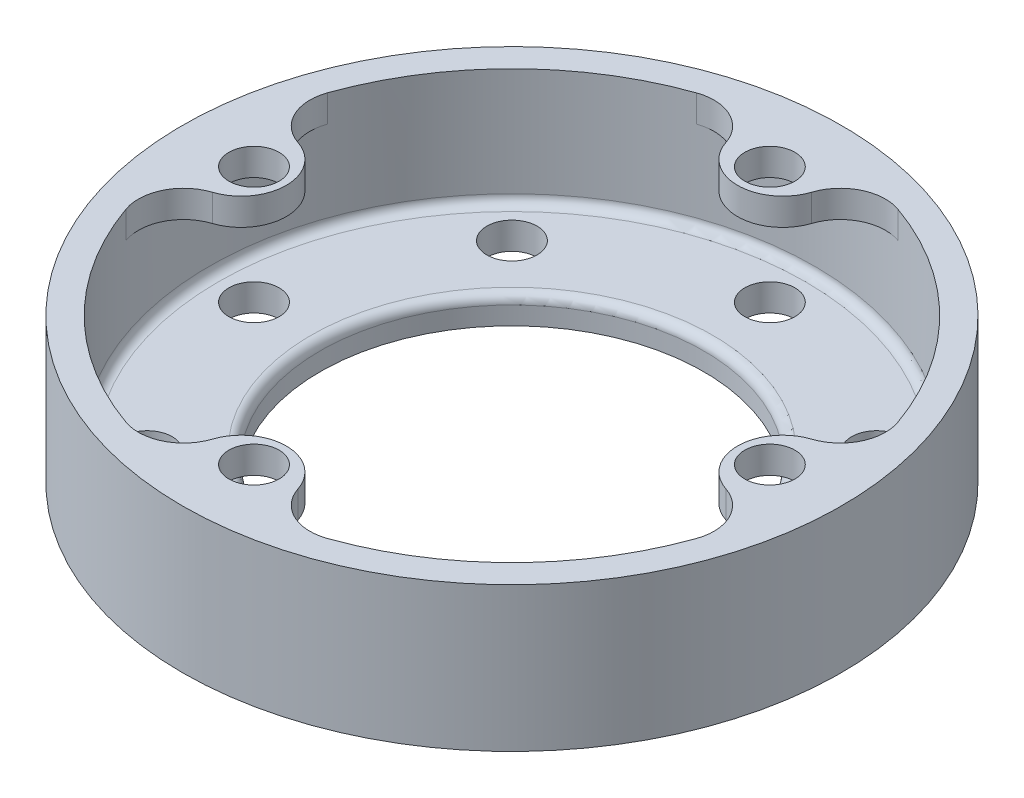
ISO-10303-21;
HEADER;
FILE_DESCRIPTION(('STEP AP214'),'2;1');
FILE_NAME('part.step','',(''),(''),'','','');
FILE_SCHEMA(('AUTOMOTIVE_DESIGN { 1 0 10303 214 1 1 1 1 }'));
ENDSEC;
DATA;
#1=APPLICATION_CONTEXT('core data for automotive mechanical design processes');
#2=APPLICATION_PROTOCOL_DEFINITION('international standard','automotive_design',2000,#1);
#3=PRODUCT_CONTEXT('',#1,'mechanical');
#4=PRODUCT('Part','Part','',(#3));
#5=PRODUCT_RELATED_PRODUCT_CATEGORY('part','',(#4));
#6=PRODUCT_DEFINITION_FORMATION('','',#4);
#7=PRODUCT_DEFINITION_CONTEXT('part definition',#1,'design');
#8=PRODUCT_DEFINITION('design','',#6,#7);
#9=PRODUCT_DEFINITION_SHAPE('','',#8);
#10=(LENGTH_UNIT() NAMED_UNIT(*) SI_UNIT(.MILLI.,.METRE.));
#11=(NAMED_UNIT(*) PLANE_ANGLE_UNIT() SI_UNIT($,.RADIAN.));
#12=(NAMED_UNIT(*) SI_UNIT($,.STERADIAN.) SOLID_ANGLE_UNIT());
#13=UNCERTAINTY_MEASURE_WITH_UNIT(LENGTH_MEASURE(1.E-05),#10,'distance_accuracy_value','');
#14=(GEOMETRIC_REPRESENTATION_CONTEXT(3) GLOBAL_UNCERTAINTY_ASSIGNED_CONTEXT((#13)) GLOBAL_UNIT_ASSIGNED_CONTEXT((#10,
#11,#12)) REPRESENTATION_CONTEXT('',''));
#15=CARTESIAN_POINT('',(0.,0.,0.));
#16=DIRECTION('',(0.,0.,1.));
#17=DIRECTION('',(1.,0.,0.));
#18=AXIS2_PLACEMENT_3D('',#15,#16,#17);
#19=CARTESIAN_POINT('',(0.,32.,0.));
#20=DIRECTION('',(0.,-1.,0.));
#21=DIRECTION('',(0.,0.,-1.));
#22=AXIS2_PLACEMENT_3D('',#19,#20,#21);
#23=CYLINDRICAL_SURFACE('',#22,67.025);
#24=CARTESIAN_POINT('',(0.,8.,0.));
#25=DIRECTION('',(0.,1.,0.));
#26=DIRECTION('',(0.,0.,1.));
#27=AXIS2_PLACEMENT_3D('',#24,#25,#26);
#28=CIRCLE('',#27,67.025);
#29=CARTESIAN_POINT('',(0.,8.,67.025));
#30=VERTEX_POINT('',#29);
#31=EDGE_CURVE('E11',#30,#30,#28,.F.);
#32=ORIENTED_EDGE('',*,*,#31,.T.);
#33=EDGE_LOOP('',(#32));
#34=FACE_BOUND('',#33,.T.);
#35=CARTESIAN_POINT('',(0.,32.,0.));
#36=DIRECTION('',(0.,1.,0.));
#37=DIRECTION('',(0.,0.,1.));
#38=AXIS2_PLACEMENT_3D('',#35,#36,#37);
#39=CIRCLE('',#38,67.025);
#40=CARTESIAN_POINT('',(22.3358935102047,32.,63.1938168344087));
#41=VERTEX_POINT('',#40);
#42=CARTESIAN_POINT('',(63.1938166673644,32.,22.3358939828146));
#43=VERTEX_POINT('',#42);
#44=EDGE_CURVE('E398',#41,#43,#39,.T.);
#45=ORIENTED_EDGE('',*,*,#44,.T.);
#46=DIRECTION('',(0.,-1.,0.));
#47=VECTOR('',#46,1.);
#48=CARTESIAN_POINT('',(63.1938166673644,32.,22.3358939828146));
#49=LINE('',#48,#47);
#50=CARTESIAN_POINT('',(63.1938166673644,26.,22.3358939828146));
#51=VERTEX_POINT('',#50);
#52=EDGE_CURVE('E255',#43,#51,#49,.T.);
#53=ORIENTED_EDGE('',*,*,#52,.T.);
#54=CARTESIAN_POINT('',(0.,26.,0.));
#55=DIRECTION('',(0.,1.,0.));
#56=DIRECTION('',(-1.,0.,-4.48724098485128E-09));
#57=AXIS2_PLACEMENT_3D('',#54,#55,#56);
#58=CIRCLE('',#57,67.025);
#59=CARTESIAN_POINT('',(63.1938168678175,26.,-22.3358934156828));
#60=VERTEX_POINT('',#59);
#61=EDGE_CURVE('E52',#51,#60,#58,.T.);
#62=ORIENTED_EDGE('',*,*,#61,.T.);
#63=DIRECTION('',(0.,-1.,0.));
#64=VECTOR('',#63,1.);
#65=CARTESIAN_POINT('',(63.1938168678175,32.,-22.3358934156828));
#66=LINE('',#65,#64);
#67=CARTESIAN_POINT('',(63.1938168678175,32.,-22.3358934156828));
#68=VERTEX_POINT('',#67);
#69=EDGE_CURVE('E253',#60,#68,#66,.F.);
#70=ORIENTED_EDGE('',*,*,#69,.T.);
#71=CARTESIAN_POINT('',(22.3358936992487,32.,-63.193816767591));
#72=VERTEX_POINT('',#71);
#73=EDGE_CURVE('E188',#68,#72,#39,.T.);
#74=ORIENTED_EDGE('',*,*,#73,.T.);
#75=DIRECTION('',(0.,-1.,0.));
#76=VECTOR('',#75,1.);
#77=CARTESIAN_POINT('',(22.3358936992487,32.,-63.193816767591));
#78=LINE('',#77,#76);
#79=CARTESIAN_POINT('',(22.3358936992487,26.,-63.193816767591));
#80=VERTEX_POINT('',#79);
#81=EDGE_CURVE('E155',#72,#80,#78,.T.);
#82=ORIENTED_EDGE('',*,*,#81,.T.);
#83=CARTESIAN_POINT('',(0.,26.,0.));
#84=DIRECTION('',(0.,1.,0.));
#85=DIRECTION('',(0.,0.,1.));
#86=AXIS2_PLACEMENT_3D('',#83,#84,#85);
#87=CIRCLE('',#86,67.025);
#88=CARTESIAN_POINT('',(-22.3358936992487,26.,-63.193816767591));
#89=VERTEX_POINT('',#88);
#90=EDGE_CURVE('E176',#80,#89,#87,.T.);
#91=ORIENTED_EDGE('',*,*,#90,.T.);
#92=DIRECTION('',(0.,-1.,0.));
#93=VECTOR('',#92,1.);
#94=CARTESIAN_POINT('',(-22.3358936992487,32.,-63.193816767591));
#95=LINE('',#94,#93);
#96=CARTESIAN_POINT('',(-22.3358936992487,32.,-63.193816767591));
#97=VERTEX_POINT('',#96);
#98=EDGE_CURVE('E169',#89,#97,#95,.F.);
#99=ORIENTED_EDGE('',*,*,#98,.T.);
#100=CARTESIAN_POINT('',(-63.1938167341821,32.,-22.3358937937707));
#101=VERTEX_POINT('',#100);
#102=EDGE_CURVE('E189',#97,#101,#39,.T.);
#103=ORIENTED_EDGE('',*,*,#102,.T.);
#104=DIRECTION('',(0.,-1.,0.));
#105=VECTOR('',#104,1.);
#106=CARTESIAN_POINT('',(-63.1938167341821,32.,-22.3358937937707));
#107=LINE('',#106,#105);
#108=CARTESIAN_POINT('',(-63.1938167341821,26.,-22.3358937937707));
#109=VERTEX_POINT('',#108);
#110=EDGE_CURVE('E216',#101,#109,#107,.T.);
#111=ORIENTED_EDGE('',*,*,#110,.T.);
#112=CARTESIAN_POINT('',(0.,26.,0.));
#113=DIRECTION('',(0.,1.,0.));
#114=DIRECTION('',(1.,0.,1.49574714298016E-09));
#115=AXIS2_PLACEMENT_3D('',#112,#113,#114);
#116=CIRCLE('',#115,67.025);
#117=CARTESIAN_POINT('',(-63.1938168009998,26.,22.3358936047267));
#118=VERTEX_POINT('',#117);
#119=EDGE_CURVE('E375',#109,#118,#116,.T.);
#120=ORIENTED_EDGE('',*,*,#119,.T.);
#121=DIRECTION('',(0.,-1.,0.));
#122=VECTOR('',#121,1.);
#123=CARTESIAN_POINT('',(-63.1938168009998,32.,22.3358936047267));
#124=LINE('',#123,#122);
#125=CARTESIAN_POINT('',(-63.1938168009998,32.,22.3358936047267));
#126=VERTEX_POINT('',#125);
#127=EDGE_CURVE('E213',#118,#126,#124,.F.);
#128=ORIENTED_EDGE('',*,*,#127,.T.);
#129=CARTESIAN_POINT('',(-22.3358938882926,32.,63.1938167007733));
#130=VERTEX_POINT('',#129);
#131=EDGE_CURVE('E193',#126,#130,#39,.T.);
#132=ORIENTED_EDGE('',*,*,#131,.T.);
#133=DIRECTION('',(0.,-1.,0.));
#134=VECTOR('',#133,1.);
#135=CARTESIAN_POINT('',(-22.3358938882926,32.,63.1938167007733));
#136=LINE('',#135,#134);
#137=CARTESIAN_POINT('',(-22.3358938882927,26.,63.1938167007733));
#138=VERTEX_POINT('',#137);
#139=EDGE_CURVE('E236',#130,#138,#136,.T.);
#140=ORIENTED_EDGE('',*,*,#139,.T.);
#141=CARTESIAN_POINT('',(0.,26.,0.));
#142=DIRECTION('',(0.,1.,0.));
#143=DIRECTION('',(2.99149428596032E-09,0.,-1.));
#144=AXIS2_PLACEMENT_3D('',#141,#142,#143);
#145=CIRCLE('',#144,67.025);
#146=CARTESIAN_POINT('',(22.3358935102047,26.,63.1938168344087));
#147=VERTEX_POINT('',#146);
#148=EDGE_CURVE('E361',#138,#147,#145,.T.);
#149=ORIENTED_EDGE('',*,*,#148,.T.);
#150=DIRECTION('',(0.,-1.,0.));
#151=VECTOR('',#150,1.);
#152=CARTESIAN_POINT('',(22.3358935102047,32.,63.1938168344087));
#153=LINE('',#152,#151);
#154=EDGE_CURVE('E233',#147,#41,#153,.F.);
#155=ORIENTED_EDGE('',*,*,#154,.T.);
#156=EDGE_LOOP('',(#45,#53,#62,#70,#74,#82,#91,#99,#103,#111,#120,#128,#132,#140,#149,#155));
#157=FACE_BOUND('',#156,.T.);
#158=ADVANCED_FACE('F37',(#34,#157),#23,.F.);
#159=CARTESIAN_POINT('',(0.,32.,0.));
#160=DIRECTION('',(0.,-1.,0.));
#161=DIRECTION('',(0.,0.,-1.));
#162=AXIS2_PLACEMENT_3D('',#159,#160,#161);
#163=CYLINDRICAL_SURFACE('',#162,73.025);
#164=CARTESIAN_POINT('',(0.,32.,0.));
#165=DIRECTION('',(0.,1.,0.));
#166=DIRECTION('',(0.,0.,1.));
#167=AXIS2_PLACEMENT_3D('',#164,#165,#166);
#168=CIRCLE('',#167,73.025);
#169=CARTESIAN_POINT('',(0.,32.,73.025));
#170=VERTEX_POINT('',#169);
#171=EDGE_CURVE('E194',#170,#170,#168,.T.);
#172=ORIENTED_EDGE('',*,*,#171,.F.);
#173=EDGE_LOOP('',(#172));
#174=FACE_BOUND('',#173,.T.);
#175=CARTESIAN_POINT('',(0.,0.,0.));
#176=DIRECTION('',(0.,1.,0.));
#177=DIRECTION('',(0.,0.,1.));
#178=AXIS2_PLACEMENT_3D('',#175,#176,#177);
#179=CIRCLE('',#178,73.025);
#180=CARTESIAN_POINT('',(0.,0.,73.025));
#181=VERTEX_POINT('',#180);
#182=EDGE_CURVE('E192',#181,#181,#179,.T.);
#183=ORIENTED_EDGE('',*,*,#182,.T.);
#184=EDGE_LOOP('',(#183));
#185=FACE_BOUND('',#184,.T.);
#186=ADVANCED_FACE('F295',(#174,#185),#163,.T.);
#187=CARTESIAN_POINT('',(0.,32.,0.));
#188=DIRECTION('',(0.,1.,0.));
#189=DIRECTION('',(0.,0.,1.));
#190=AXIS2_PLACEMENT_3D('',#187,#188,#189);
#191=PLANE('',#190);
#192=CARTESIAN_POINT('',(-1.70963898442633E-07,32.,57.15));
#193=DIRECTION('',(0.,1.,0.));
#194=DIRECTION('',(2.99149428596032E-09,0.,-1.));
#195=AXIS2_PLACEMENT_3D('',#192,#193,#194);
#196=CIRCLE('',#195,5.55625);
#197=CARTESIAN_POINT('',(-1.54342408316265E-07,32.,51.59375));
#198=VERTEX_POINT('',#197);
#199=EDGE_CURVE('E748',#198,#198,#196,.T.);
#200=ORIENTED_EDGE('',*,*,#199,.F.);
#201=EDGE_LOOP('',(#200));
#202=FACE_BOUND('',#201,.T.);
#203=CARTESIAN_POINT('',(57.15,32.,2.5644582228425E-07));
#204=DIRECTION('',(0.,1.,0.));
#205=DIRECTION('',(-1.,0.,-4.48724098485128E-09));
#206=AXIS2_PLACEMENT_3D('',#203,#204,#205);
#207=CIRCLE('',#206,5.55625);
#208=CARTESIAN_POINT('',(51.59375,32.,2.31513589562171E-07));
#209=VERTEX_POINT('',#208);
#210=EDGE_CURVE('E742',#209,#209,#207,.T.);
#211=ORIENTED_EDGE('',*,*,#210,.F.);
#212=EDGE_LOOP('',(#211));
#213=FACE_BOUND('',#212,.T.);
#214=CARTESIAN_POINT('',(-57.15,32.,-8.54819492213163E-08));
#215=DIRECTION('',(0.,1.,0.));
#216=DIRECTION('',(1.,0.,1.49574714298016E-09));
#217=AXIS2_PLACEMENT_3D('',#214,#215,#216);
#218=CIRCLE('',#217,5.55625);
#219=CARTESIAN_POINT('',(-51.59375,32.,-7.71712041581327E-08));
#220=VERTEX_POINT('',#219);
#221=EDGE_CURVE('E755',#220,#220,#218,.T.);
#222=ORIENTED_EDGE('',*,*,#221,.F.);
#223=EDGE_LOOP('',(#222));
#224=FACE_BOUND('',#223,.T.);
#225=CARTESIAN_POINT('',(0.,32.,-57.15));
#226=DIRECTION('',(0.,1.,0.));
#227=DIRECTION('',(0.,0.,1.));
#228=AXIS2_PLACEMENT_3D('',#225,#226,#227);
#229=CIRCLE('',#228,5.55625);
#230=CARTESIAN_POINT('',(0.,32.,-51.59375));
#231=VERTEX_POINT('',#230);
#232=EDGE_CURVE('E181',#231,#231,#229,.T.);
#233=ORIENTED_EDGE('',*,*,#232,.F.);
#234=EDGE_LOOP('',(#233));
#235=FACE_BOUND('',#234,.T.);
#236=ORIENTED_EDGE('',*,*,#102,.F.);
#237=CARTESIAN_POINT('',(-19.003421681457,32.,-53.765421875));
#238=DIRECTION('',(0.,1.,0.));
#239=DIRECTION('',(0.,0.,1.));
#240=AXIS2_PLACEMENT_3D('',#237,#238,#239);
#241=CIRCLE('',#240,10.);
#242=CARTESIAN_POINT('',(-9.50171084072852,32.,-56.8827109375));
#243=VERTEX_POINT('',#242);
#244=EDGE_CURVE('E175',#97,#243,#241,.F.);
#245=ORIENTED_EDGE('',*,*,#244,.T.);
#246=CARTESIAN_POINT('',(0.,32.,-60.));
#247=DIRECTION('',(0.,-1.,0.));
#248=DIRECTION('',(0.,0.,-1.));
#249=AXIS2_PLACEMENT_3D('',#246,#247,#248);
#250=CIRCLE('',#249,10.);
#251=CARTESIAN_POINT('',(9.50171084072852,32.,-56.8827109375));
#252=VERTEX_POINT('',#251);
#253=EDGE_CURVE('E165',#252,#243,#250,.T.);
#254=ORIENTED_EDGE('',*,*,#253,.F.);
#255=CARTESIAN_POINT('',(19.003421681457,32.,-53.765421875));
#256=DIRECTION('',(0.,1.,0.));
#257=DIRECTION('',(0.,0.,1.));
#258=AXIS2_PLACEMENT_3D('',#255,#256,#257);
#259=CIRCLE('',#258,10.);
#260=EDGE_CURVE('E149',#252,#72,#259,.F.);
#261=ORIENTED_EDGE('',*,*,#260,.T.);
#262=ORIENTED_EDGE('',*,*,#73,.F.);
#263=CARTESIAN_POINT('',(53.7654219602729,32.,-19.0034214401986));
#264=DIRECTION('',(0.,1.,0.));
#265=DIRECTION('',(0.,0.,1.));
#266=AXIS2_PLACEMENT_3D('',#263,#264,#265);
#267=CIRCLE('',#266,10.);
#268=CARTESIAN_POINT('',(56.8827109801365,32.,-9.50171058548209));
#269=VERTEX_POINT('',#268);
#270=EDGE_CURVE('E261',#68,#269,#267,.F.);
#271=ORIENTED_EDGE('',*,*,#270,.T.);
#272=CARTESIAN_POINT('',(60.,32.,2.69234459091077E-07));
#273=DIRECTION('',(0.,-1.,0.));
#274=DIRECTION('',(1.,0.,4.48724098485128E-09));
#275=AXIS2_PLACEMENT_3D('',#272,#273,#274);
#276=CIRCLE('',#275,10.);
#277=CARTESIAN_POINT('',(56.8827108948635,32.,9.50171109597495));
#278=VERTEX_POINT('',#277);
#279=EDGE_CURVE('E363',#278,#269,#276,.T.);
#280=ORIENTED_EDGE('',*,*,#279,.F.);
#281=CARTESIAN_POINT('',(53.7654217897271,32.,19.0034219227154));
#282=DIRECTION('',(0.,1.,0.));
#283=DIRECTION('',(0.,0.,1.));
#284=AXIS2_PLACEMENT_3D('',#281,#282,#283);
#285=CIRCLE('',#284,10.);
#286=EDGE_CURVE('E257',#278,#43,#285,.F.);
#287=ORIENTED_EDGE('',*,*,#286,.T.);
#288=ORIENTED_EDGE('',*,*,#44,.F.);
#289=CARTESIAN_POINT('',(19.0034215206181,32.,53.7654219318486));
#290=DIRECTION('',(0.,1.,0.));
#291=DIRECTION('',(0.,0.,1.));
#292=AXIS2_PLACEMENT_3D('',#289,#290,#291);
#293=CIRCLE('',#292,10.);
#294=CARTESIAN_POINT('',(9.50171067056421,32.,56.8827109659243));
#295=VERTEX_POINT('',#294);
#296=EDGE_CURVE('E243',#41,#295,#293,.F.);
#297=ORIENTED_EDGE('',*,*,#296,.T.);
#298=CARTESIAN_POINT('',(-1.79489657157619E-07,32.,60.));
#299=DIRECTION('',(0.,-1.,0.));
#300=DIRECTION('',(-2.99149428596032E-09,0.,1.));
#301=AXIS2_PLACEMENT_3D('',#298,#299,#300);
#302=CIRCLE('',#301,10.);
#303=CARTESIAN_POINT('',(-9.50171101089282,32.,56.8827109090757));
#304=VERTEX_POINT('',#303);
#305=EDGE_CURVE('E358',#304,#295,#302,.T.);
#306=ORIENTED_EDGE('',*,*,#305,.F.);
#307=CARTESIAN_POINT('',(-19.003421842296,32.,53.7654218181514));
#308=DIRECTION('',(0.,1.,0.));
#309=DIRECTION('',(0.,0.,1.));
#310=AXIS2_PLACEMENT_3D('',#307,#308,#309);
#311=CIRCLE('',#310,10.);
#312=EDGE_CURVE('E239',#304,#130,#311,.F.);
#313=ORIENTED_EDGE('',*,*,#312,.T.);
#314=ORIENTED_EDGE('',*,*,#131,.F.);
#315=CARTESIAN_POINT('',(-53.7654219034243,32.,19.0034216010375));
#316=DIRECTION('',(0.,1.,0.));
#317=DIRECTION('',(0.,0.,1.));
#318=AXIS2_PLACEMENT_3D('',#315,#316,#317);
#319=CIRCLE('',#318,10.);
#320=CARTESIAN_POINT('',(-56.8827109517121,32.,9.50171075564637));
#321=VERTEX_POINT('',#320);
#322=EDGE_CURVE('E223',#126,#321,#319,.F.);
#323=ORIENTED_EDGE('',*,*,#322,.T.);
#324=CARTESIAN_POINT('',(-60.,32.,-8.97448285788097E-08));
#325=DIRECTION('',(0.,-1.,0.));
#326=DIRECTION('',(-1.,0.,-1.49574714298016E-09));
#327=AXIS2_PLACEMENT_3D('',#324,#325,#326);
#328=CIRCLE('',#327,10.);
#329=CARTESIAN_POINT('',(-56.8827109232878,32.,-9.50171092581067));
#330=VERTEX_POINT('',#329);
#331=EDGE_CURVE('E373',#330,#321,#328,.T.);
#332=ORIENTED_EDGE('',*,*,#331,.F.);
#333=CARTESIAN_POINT('',(-53.7654218465757,32.,-19.0034217618765));
#334=DIRECTION('',(0.,1.,0.));
#335=DIRECTION('',(0.,0.,1.));
#336=AXIS2_PLACEMENT_3D('',#333,#334,#335);
#337=CIRCLE('',#336,10.);
#338=EDGE_CURVE('E219',#330,#101,#337,.F.);
#339=ORIENTED_EDGE('',*,*,#338,.T.);
#340=EDGE_LOOP('',(#236,#245,#254,#261,#262,#271,#280,#287,#288,#297,#306,#313,#314,#323,#332,#339));
#341=FACE_BOUND('',#340,.T.);
#342=ORIENTED_EDGE('',*,*,#171,.T.);
#343=EDGE_LOOP('',(#342));
#344=FACE_BOUND('',#343,.T.);
#345=ADVANCED_FACE('F173',(#202,#213,#224,#235,#341,#344),#191,.T.);
#346=CARTESIAN_POINT('',(0.,0.,0.));
#347=DIRECTION('',(0.,1.,0.));
#348=DIRECTION('',(0.,0.,1.));
#349=AXIS2_PLACEMENT_3D('',#346,#347,#348);
#350=PLANE('',#349);
#351=CARTESIAN_POINT('',(57.15,0.,1.99538158514885E-13));
#352=DIRECTION('',(0.,1.,0.));
#353=DIRECTION('',(-1.,0.,0.));
#354=AXIS2_PLACEMENT_3D('',#351,#352,#353);
#355=CIRCLE('',#354,5.55625);
#356=CARTESIAN_POINT('',(51.59375,0.,1.80138615325938E-13));
#357=VERTEX_POINT('',#356);
#358=EDGE_CURVE('E781',#357,#357,#355,.T.);
#359=ORIENTED_EDGE('',*,*,#358,.T.);
#360=EDGE_LOOP('',(#359));
#361=FACE_BOUND('',#360,.T.);
#362=CARTESIAN_POINT('',(40.411152544811,0.,40.4111525448114));
#363=DIRECTION('',(0.,1.,0.));
#364=DIRECTION('',(-0.707106781186544,0.,-0.707106781186551));
#365=AXIS2_PLACEMENT_3D('',#362,#363,#364);
#366=CIRCLE('',#365,5.55625);
#367=CARTESIAN_POINT('',(36.4822904918432,0.,36.4822904918436));
#368=VERTEX_POINT('',#367);
#369=EDGE_CURVE('E800',#368,#368,#366,.T.);
#370=ORIENTED_EDGE('',*,*,#369,.T.);
#371=EDGE_LOOP('',(#370));
#372=FACE_BOUND('',#371,.T.);
#373=CARTESIAN_POINT('',(-3.9907631702977E-13,0.,57.15));
#374=DIRECTION('',(0.,1.,0.));
#375=DIRECTION('',(0.,0.,-1.));
#376=AXIS2_PLACEMENT_3D('',#373,#374,#375);
#377=CIRCLE('',#376,5.55625);
#378=CARTESIAN_POINT('',(-3.60277230651876E-13,0.,51.59375));
#379=VERTEX_POINT('',#378);
#380=EDGE_CURVE('E796',#379,#379,#377,.T.);
#381=ORIENTED_EDGE('',*,*,#380,.T.);
#382=EDGE_LOOP('',(#381));
#383=FACE_BOUND('',#382,.T.);
#384=CARTESIAN_POINT('',(-40.4111525448115,0.,40.4111525448108));
#385=DIRECTION('',(0.,1.,0.));
#386=DIRECTION('',(0.707106781186554,0.,-0.707106781186541));
#387=AXIS2_PLACEMENT_3D('',#384,#385,#386);
#388=CIRCLE('',#387,5.55625);
#389=CARTESIAN_POINT('',(-36.4822904918438,0.,36.4822904918431));
#390=VERTEX_POINT('',#389);
#391=EDGE_CURVE('E792',#390,#390,#388,.T.);
#392=ORIENTED_EDGE('',*,*,#391,.T.);
#393=EDGE_LOOP('',(#392));
#394=FACE_BOUND('',#393,.T.);
#395=CARTESIAN_POINT('',(-57.15,0.,-5.98614475544655E-13));
#396=DIRECTION('',(0.,1.,0.));
#397=DIRECTION('',(1.,0.,0.));
#398=AXIS2_PLACEMENT_3D('',#395,#396,#397);
#399=CIRCLE('',#398,5.55625);
#400=CARTESIAN_POINT('',(-51.59375,0.,-5.40415845977814E-13));
#401=VERTEX_POINT('',#400);
#402=EDGE_CURVE('E788',#401,#401,#399,.T.);
#403=ORIENTED_EDGE('',*,*,#402,.T.);
#404=EDGE_LOOP('',(#403));
#405=FACE_BOUND('',#404,.T.);
#406=CARTESIAN_POINT('',(-40.4111525448107,0.,-40.4111525448117));
#407=DIRECTION('',(0.,1.,0.));
#408=DIRECTION('',(0.707106781186539,0.,0.707106781186556));
#409=AXIS2_PLACEMENT_3D('',#406,#407,#408);
#410=CIRCLE('',#409,5.55625);
#411=CARTESIAN_POINT('',(-36.482290491843,0.,-36.4822904918439));
#412=VERTEX_POINT('',#411);
#413=EDGE_CURVE('E784',#412,#412,#410,.T.);
#414=ORIENTED_EDGE('',*,*,#413,.T.);
#415=EDGE_LOOP('',(#414));
#416=FACE_BOUND('',#415,.T.);
#417=CARTESIAN_POINT('',(40.4111525448113,0.,-40.4111525448111));
#418=DIRECTION('',(0.,1.,0.));
#419=DIRECTION('',(-0.707106781186549,0.,0.707106781186546));
#420=AXIS2_PLACEMENT_3D('',#417,#418,#419);
#421=CIRCLE('',#420,5.55625);
#422=CARTESIAN_POINT('',(36.4822904918435,0.,-36.4822904918434));
#423=VERTEX_POINT('',#422);
#424=EDGE_CURVE('E739',#423,#423,#421,.T.);
#425=ORIENTED_EDGE('',*,*,#424,.T.);
#426=EDGE_LOOP('',(#425));
#427=FACE_BOUND('',#426,.T.);
#428=CARTESIAN_POINT('',(0.,0.,-57.15));
#429=DIRECTION('',(0.,1.,0.));
#430=DIRECTION('',(0.,0.,1.));
#431=AXIS2_PLACEMENT_3D('',#428,#429,#430);
#432=CIRCLE('',#431,5.55625);
#433=CARTESIAN_POINT('',(0.,0.,-51.59375));
#434=VERTEX_POINT('',#433);
#435=EDGE_CURVE('E738',#434,#434,#432,.T.);
#436=ORIENTED_EDGE('',*,*,#435,.T.);
#437=EDGE_LOOP('',(#436));
#438=FACE_BOUND('',#437,.T.);
#439=CARTESIAN_POINT('',(0.,0.,0.));
#440=DIRECTION('',(0.,1.,0.));
#441=DIRECTION('',(0.,0.,1.));
#442=AXIS2_PLACEMENT_3D('',#439,#440,#441);
#443=CIRCLE('',#442,42.5);
#444=CARTESIAN_POINT('',(0.,0.,42.5));
#445=VERTEX_POINT('',#444);
#446=EDGE_CURVE('E185',#445,#445,#443,.T.);
#447=ORIENTED_EDGE('',*,*,#446,.T.);
#448=EDGE_LOOP('',(#447));
#449=FACE_BOUND('',#448,.T.);
#450=ORIENTED_EDGE('',*,*,#182,.F.);
#451=EDGE_LOOP('',(#450));
#452=FACE_BOUND('',#451,.T.);
#453=ADVANCED_FACE('F288',(#361,#372,#383,#394,#405,#416,#427,#438,#449,#452),#350,.F.);
#454=CARTESIAN_POINT('',(0.,6.,0.));
#455=DIRECTION('',(0.,1.,0.));
#456=DIRECTION('',(0.,0.,1.));
#457=AXIS2_PLACEMENT_3D('',#454,#455,#456);
#458=PLANE('',#457);
#459=CARTESIAN_POINT('',(0.,6.,0.));
#460=DIRECTION('',(0.,1.,0.));
#461=DIRECTION('',(0.,0.,1.));
#462=AXIS2_PLACEMENT_3D('',#459,#460,#461);
#463=CIRCLE('',#462,44.5);
#464=CARTESIAN_POINT('',(0.,6.,44.5));
#465=VERTEX_POINT('',#464);
#466=EDGE_CURVE('E45',#465,#465,#463,.F.);
#467=ORIENTED_EDGE('',*,*,#466,.T.);
#468=EDGE_LOOP('',(#467));
#469=FACE_BOUND('',#468,.T.);
#470=CARTESIAN_POINT('',(0.,6.,0.));
#471=DIRECTION('',(0.,1.,0.));
#472=DIRECTION('',(0.,0.,1.));
#473=AXIS2_PLACEMENT_3D('',#470,#471,#472);
#474=CIRCLE('',#473,65.025);
#475=CARTESIAN_POINT('',(0.,6.,65.025));
#476=VERTEX_POINT('',#475);
#477=EDGE_CURVE('E268',#476,#476,#474,.T.);
#478=ORIENTED_EDGE('',*,*,#477,.T.);
#479=EDGE_LOOP('',(#478));
#480=FACE_BOUND('',#479,.T.);
#481=CARTESIAN_POINT('',(57.15,6.,1.99538158514885E-13));
#482=DIRECTION('',(0.,1.,0.));
#483=DIRECTION('',(-1.,0.,0.));
#484=AXIS2_PLACEMENT_3D('',#481,#482,#483);
#485=CIRCLE('',#484,5.55625);
#486=CARTESIAN_POINT('',(51.59375,6.,1.80138615325938E-13));
#487=VERTEX_POINT('',#486);
#488=EDGE_CURVE('E709',#487,#487,#485,.T.);
#489=ORIENTED_EDGE('',*,*,#488,.F.);
#490=EDGE_LOOP('',(#489));
#491=FACE_BOUND('',#490,.T.);
#492=CARTESIAN_POINT('',(40.411152544811,6.,40.4111525448114));
#493=DIRECTION('',(0.,1.,0.));
#494=DIRECTION('',(-0.707106781186544,0.,-0.707106781186551));
#495=AXIS2_PLACEMENT_3D('',#492,#493,#494);
#496=CIRCLE('',#495,5.55625);
#497=CARTESIAN_POINT('',(36.4822904918432,6.,36.4822904918436));
#498=VERTEX_POINT('',#497);
#499=EDGE_CURVE('E713',#498,#498,#496,.T.);
#500=ORIENTED_EDGE('',*,*,#499,.F.);
#501=EDGE_LOOP('',(#500));
#502=FACE_BOUND('',#501,.T.);
#503=CARTESIAN_POINT('',(-3.9907631702977E-13,6.,57.15));
#504=DIRECTION('',(0.,1.,0.));
#505=DIRECTION('',(0.,0.,-1.));
#506=AXIS2_PLACEMENT_3D('',#503,#504,#505);
#507=CIRCLE('',#506,5.55625);
#508=CARTESIAN_POINT('',(-3.60277230651876E-13,6.,51.59375));
#509=VERTEX_POINT('',#508);
#510=EDGE_CURVE('E717',#509,#509,#507,.T.);
#511=ORIENTED_EDGE('',*,*,#510,.F.);
#512=EDGE_LOOP('',(#511));
#513=FACE_BOUND('',#512,.T.);
#514=CARTESIAN_POINT('',(-40.4111525448115,6.,40.4111525448108));
#515=DIRECTION('',(0.,1.,0.));
#516=DIRECTION('',(0.707106781186554,0.,-0.707106781186541));
#517=AXIS2_PLACEMENT_3D('',#514,#515,#516);
#518=CIRCLE('',#517,5.55625);
#519=CARTESIAN_POINT('',(-36.4822904918438,6.,36.4822904918431));
#520=VERTEX_POINT('',#519);
#521=EDGE_CURVE('E721',#520,#520,#518,.T.);
#522=ORIENTED_EDGE('',*,*,#521,.F.);
#523=EDGE_LOOP('',(#522));
#524=FACE_BOUND('',#523,.T.);
#525=CARTESIAN_POINT('',(-57.15,6.,-5.98614475544655E-13));
#526=DIRECTION('',(0.,1.,0.));
#527=DIRECTION('',(1.,0.,0.));
#528=AXIS2_PLACEMENT_3D('',#525,#526,#527);
#529=CIRCLE('',#528,5.55625);
#530=CARTESIAN_POINT('',(-51.59375,6.,-5.40415845977814E-13));
#531=VERTEX_POINT('',#530);
#532=EDGE_CURVE('E725',#531,#531,#529,.T.);
#533=ORIENTED_EDGE('',*,*,#532,.F.);
#534=EDGE_LOOP('',(#533));
#535=FACE_BOUND('',#534,.T.);
#536=CARTESIAN_POINT('',(-40.4111525448107,6.,-40.4111525448117));
#537=DIRECTION('',(0.,1.,0.));
#538=DIRECTION('',(0.707106781186539,0.,0.707106781186556));
#539=AXIS2_PLACEMENT_3D('',#536,#537,#538);
#540=CIRCLE('',#539,5.55625);
#541=CARTESIAN_POINT('',(-36.482290491843,6.,-36.4822904918439));
#542=VERTEX_POINT('',#541);
#543=EDGE_CURVE('E729',#542,#542,#540,.T.);
#544=ORIENTED_EDGE('',*,*,#543,.F.);
#545=EDGE_LOOP('',(#544));
#546=FACE_BOUND('',#545,.T.);
#547=CARTESIAN_POINT('',(40.4111525448113,6.,-40.4111525448111));
#548=DIRECTION('',(0.,1.,0.));
#549=DIRECTION('',(-0.707106781186549,0.,0.707106781186546));
#550=AXIS2_PLACEMENT_3D('',#547,#548,#549);
#551=CIRCLE('',#550,5.55625);
#552=CARTESIAN_POINT('',(36.4822904918435,6.,-36.4822904918434));
#553=VERTEX_POINT('',#552);
#554=EDGE_CURVE('E733',#553,#553,#551,.T.);
#555=ORIENTED_EDGE('',*,*,#554,.F.);
#556=EDGE_LOOP('',(#555));
#557=FACE_BOUND('',#556,.T.);
#558=CARTESIAN_POINT('',(0.,6.,-57.15));
#559=DIRECTION('',(0.,1.,0.));
#560=DIRECTION('',(0.,0.,1.));
#561=AXIS2_PLACEMENT_3D('',#558,#559,#560);
#562=CIRCLE('',#561,5.55625);
#563=CARTESIAN_POINT('',(0.,6.,-51.59375));
#564=VERTEX_POINT('',#563);
#565=EDGE_CURVE('E736',#564,#564,#562,.T.);
#566=ORIENTED_EDGE('',*,*,#565,.F.);
#567=EDGE_LOOP('',(#566));
#568=FACE_BOUND('',#567,.T.);
#569=ADVANCED_FACE('F273',(#469,#480,#491,#502,#513,#524,#535,#546,#557,#568),#458,.T.);
#570=CARTESIAN_POINT('',(0.,0.,0.));
#571=DIRECTION('',(0.,1.,0.));
#572=DIRECTION('',(0.,0.,1.));
#573=AXIS2_PLACEMENT_3D('',#570,#571,#572);
#574=CYLINDRICAL_SURFACE('',#573,42.5);
#575=CARTESIAN_POINT('',(0.,4.,0.));
#576=DIRECTION('',(0.,1.,0.));
#577=DIRECTION('',(0.,0.,1.));
#578=AXIS2_PLACEMENT_3D('',#575,#576,#577);
#579=CIRCLE('',#578,42.5);
#580=CARTESIAN_POINT('',(0.,4.,42.5));
#581=VERTEX_POINT('',#580);
#582=EDGE_CURVE('E265',#581,#581,#579,.T.);
#583=ORIENTED_EDGE('',*,*,#582,.T.);
#584=EDGE_LOOP('',(#583));
#585=FACE_BOUND('',#584,.T.);
#586=ORIENTED_EDGE('',*,*,#446,.F.);
#587=EDGE_LOOP('',(#586));
#588=FACE_BOUND('',#587,.T.);
#589=ADVANCED_FACE('F282',(#585,#588),#574,.F.);
#590=CARTESIAN_POINT('',(0.,26.,-60.));
#591=DIRECTION('',(0.,1.,0.));
#592=DIRECTION('',(0.,0.,1.));
#593=AXIS2_PLACEMENT_3D('',#590,#591,#592);
#594=CYLINDRICAL_SURFACE('',#593,10.);
#595=CARTESIAN_POINT('',(0.,26.,-60.));
#596=DIRECTION('',(0.,-1.,0.));
#597=DIRECTION('',(0.,0.,-1.));
#598=AXIS2_PLACEMENT_3D('',#595,#596,#597);
#599=CIRCLE('',#598,10.);
#600=CARTESIAN_POINT('',(9.50171084072852,26.,-56.8827109375));
#601=VERTEX_POINT('',#600);
#602=CARTESIAN_POINT('',(-9.50171084072852,26.,-56.8827109375));
#603=VERTEX_POINT('',#602);
#604=EDGE_CURVE('E168',#601,#603,#599,.T.);
#605=ORIENTED_EDGE('',*,*,#604,.F.);
#606=DIRECTION('',(0.,1.,0.));
#607=VECTOR('',#606,1.);
#608=CARTESIAN_POINT('',(9.50171084072852,26.,-56.8827109375));
#609=LINE('',#608,#607);
#610=EDGE_CURVE('E153',#601,#252,#609,.T.);
#611=ORIENTED_EDGE('',*,*,#610,.T.);
#612=ORIENTED_EDGE('',*,*,#253,.T.);
#613=DIRECTION('',(0.,1.,0.));
#614=VECTOR('',#613,1.);
#615=CARTESIAN_POINT('',(-9.50171084072852,26.,-56.8827109375));
#616=LINE('',#615,#614);
#617=EDGE_CURVE('E170',#243,#603,#616,.F.);
#618=ORIENTED_EDGE('',*,*,#617,.T.);
#619=EDGE_LOOP('',(#605,#611,#612,#618));
#620=FACE_BOUND('',#619,.T.);
#621=ADVANCED_FACE('F164',(#620),#594,.T.);
#622=CARTESIAN_POINT('',(0.,26.,0.));
#623=DIRECTION('',(0.,1.,0.));
#624=DIRECTION('',(0.,0.,1.));
#625=AXIS2_PLACEMENT_3D('',#622,#623,#624);
#626=PLANE('',#625);
#627=CARTESIAN_POINT('',(0.,26.,-57.15));
#628=DIRECTION('',(0.,1.,0.));
#629=DIRECTION('',(0.,0.,1.));
#630=AXIS2_PLACEMENT_3D('',#627,#628,#629);
#631=CIRCLE('',#630,5.55625);
#632=CARTESIAN_POINT('',(0.,26.,-51.59375));
#633=VERTEX_POINT('',#632);
#634=EDGE_CURVE('E177',#633,#633,#631,.F.);
#635=ORIENTED_EDGE('',*,*,#634,.F.);
#636=EDGE_LOOP('',(#635));
#637=FACE_BOUND('',#636,.T.);
#638=ORIENTED_EDGE('',*,*,#90,.F.);
#639=CARTESIAN_POINT('',(19.003421681457,26.,-53.765421875));
#640=DIRECTION('',(0.,1.,0.));
#641=DIRECTION('',(0.,0.,1.));
#642=AXIS2_PLACEMENT_3D('',#639,#640,#641);
#643=CIRCLE('',#642,10.);
#644=EDGE_CURVE('E159',#80,#601,#643,.T.);
#645=ORIENTED_EDGE('',*,*,#644,.T.);
#646=ORIENTED_EDGE('',*,*,#604,.T.);
#647=CARTESIAN_POINT('',(-19.003421681457,26.,-53.765421875));
#648=DIRECTION('',(0.,1.,0.));
#649=DIRECTION('',(0.,0.,1.));
#650=AXIS2_PLACEMENT_3D('',#647,#648,#649);
#651=CIRCLE('',#650,10.);
#652=EDGE_CURVE('E205',#603,#89,#651,.T.);
#653=ORIENTED_EDGE('',*,*,#652,.T.);
#654=EDGE_LOOP('',(#638,#645,#646,#653));
#655=FACE_BOUND('',#654,.T.);
#656=ADVANCED_FACE('F388',(#637,#655),#626,.F.);
#657=CARTESIAN_POINT('',(0.,-0.001000000000001,-57.15));
#658=DIRECTION('',(0.,1.,0.));
#659=DIRECTION('',(0.,0.,1.));
#660=AXIS2_PLACEMENT_3D('',#657,#658,#659);
#661=CYLINDRICAL_SURFACE('',#660,5.55625);
#662=ORIENTED_EDGE('',*,*,#232,.T.);
#663=EDGE_LOOP('',(#662));
#664=FACE_BOUND('',#663,.T.);
#665=ORIENTED_EDGE('',*,*,#634,.T.);
#666=EDGE_LOOP('',(#665));
#667=FACE_BOUND('',#666,.T.);
#668=ADVANCED_FACE('F312',(#664,#667),#661,.F.);
#669=CARTESIAN_POINT('',(19.003421681457,32.,-53.765421875));
#670=DIRECTION('',(0.,1.,0.));
#671=DIRECTION('',(0.,0.,1.));
#672=AXIS2_PLACEMENT_3D('',#669,#670,#671);
#673=CYLINDRICAL_SURFACE('',#672,10.);
#674=ORIENTED_EDGE('',*,*,#644,.F.);
#675=ORIENTED_EDGE('',*,*,#81,.F.);
#676=ORIENTED_EDGE('',*,*,#260,.F.);
#677=ORIENTED_EDGE('',*,*,#610,.F.);
#678=EDGE_LOOP('',(#674,#675,#676,#677));
#679=FACE_BOUND('',#678,.T.);
#680=ADVANCED_FACE('F152',(#679),#673,.F.);
#681=CARTESIAN_POINT('',(-19.003421681457,26.,-53.765421875));
#682=DIRECTION('',(0.,1.,0.));
#683=DIRECTION('',(0.,0.,1.));
#684=AXIS2_PLACEMENT_3D('',#681,#682,#683);
#685=CYLINDRICAL_SURFACE('',#684,10.);
#686=ORIENTED_EDGE('',*,*,#652,.F.);
#687=ORIENTED_EDGE('',*,*,#617,.F.);
#688=ORIENTED_EDGE('',*,*,#244,.F.);
#689=ORIENTED_EDGE('',*,*,#98,.F.);
#690=EDGE_LOOP('',(#686,#687,#688,#689));
#691=FACE_BOUND('',#690,.T.);
#692=ADVANCED_FACE('F311',(#691),#685,.F.);
#693=CARTESIAN_POINT('',(-60.,26.,-8.97448285788097E-08));
#694=DIRECTION('',(0.,1.,0.));
#695=DIRECTION('',(0.,0.,1.));
#696=AXIS2_PLACEMENT_3D('',#693,#694,#695);
#697=CYLINDRICAL_SURFACE('',#696,10.);
#698=CARTESIAN_POINT('',(-60.,26.,-8.97448285788097E-08));
#699=DIRECTION('',(0.,-1.,0.));
#700=DIRECTION('',(-1.,0.,-1.49574714298016E-09));
#701=AXIS2_PLACEMENT_3D('',#698,#699,#700);
#702=CIRCLE('',#701,10.);
#703=CARTESIAN_POINT('',(-56.8827109232878,26.,-9.50171092581067));
#704=VERTEX_POINT('',#703);
#705=CARTESIAN_POINT('',(-56.8827109517121,26.,9.50171075564637));
#706=VERTEX_POINT('',#705);
#707=EDGE_CURVE('E377',#704,#706,#702,.T.);
#708=ORIENTED_EDGE('',*,*,#707,.F.);
#709=DIRECTION('',(0.,1.,0.));
#710=VECTOR('',#709,1.);
#711=CARTESIAN_POINT('',(-56.8827109232878,26.,-9.50171092581067));
#712=LINE('',#711,#710);
#713=EDGE_CURVE('E210',#704,#330,#712,.T.);
#714=ORIENTED_EDGE('',*,*,#713,.T.);
#715=ORIENTED_EDGE('',*,*,#331,.T.);
#716=DIRECTION('',(0.,1.,0.));
#717=VECTOR('',#716,1.);
#718=CARTESIAN_POINT('',(-56.8827109517121,26.,9.50171075564637));
#719=LINE('',#718,#717);
#720=EDGE_CURVE('E208',#321,#706,#719,.F.);
#721=ORIENTED_EDGE('',*,*,#720,.T.);
#722=EDGE_LOOP('',(#708,#714,#715,#721));
#723=FACE_BOUND('',#722,.T.);
#724=ADVANCED_FACE('F315',(#723),#697,.T.);
#725=CARTESIAN_POINT('',(0.,26.,0.));
#726=DIRECTION('',(0.,1.,0.));
#727=DIRECTION('',(1.,0.,1.49574714298016E-09));
#728=AXIS2_PLACEMENT_3D('',#725,#726,#727);
#729=PLANE('',#728);
#730=CARTESIAN_POINT('',(-57.15,26.,-8.54819492213163E-08));
#731=DIRECTION('',(0.,1.,0.));
#732=DIRECTION('',(0.,0.,1.));
#733=AXIS2_PLACEMENT_3D('',#730,#731,#732);
#734=CIRCLE('',#733,5.55625);
#735=CARTESIAN_POINT('',(-57.15,26.,5.55624991451805));
#736=VERTEX_POINT('',#735);
#737=EDGE_CURVE('E369',#736,#736,#734,.F.);
#738=ORIENTED_EDGE('',*,*,#737,.F.);
#739=EDGE_LOOP('',(#738));
#740=FACE_BOUND('',#739,.T.);
#741=ORIENTED_EDGE('',*,*,#119,.F.);
#742=CARTESIAN_POINT('',(-53.7654218465757,26.,-19.0034217618765));
#743=DIRECTION('',(0.,1.,0.));
#744=DIRECTION('',(0.,0.,1.));
#745=AXIS2_PLACEMENT_3D('',#742,#743,#744);
#746=CIRCLE('',#745,10.);
#747=EDGE_CURVE('E221',#109,#704,#746,.T.);
#748=ORIENTED_EDGE('',*,*,#747,.T.);
#749=ORIENTED_EDGE('',*,*,#707,.T.);
#750=CARTESIAN_POINT('',(-53.7654219034243,26.,19.0034216010375));
#751=DIRECTION('',(0.,1.,0.));
#752=DIRECTION('',(0.,0.,1.));
#753=AXIS2_PLACEMENT_3D('',#750,#751,#752);
#754=CIRCLE('',#753,10.);
#755=EDGE_CURVE('E225',#706,#118,#754,.T.);
#756=ORIENTED_EDGE('',*,*,#755,.T.);
#757=EDGE_LOOP('',(#741,#748,#749,#756));
#758=FACE_BOUND('',#757,.T.);
#759=ADVANCED_FACE('F433',(#740,#758),#729,.F.);
#760=CARTESIAN_POINT('',(-1.79489657157619E-07,26.,60.));
#761=DIRECTION('',(0.,1.,0.));
#762=DIRECTION('',(0.,0.,1.));
#763=AXIS2_PLACEMENT_3D('',#760,#761,#762);
#764=CYLINDRICAL_SURFACE('',#763,10.);
#765=CARTESIAN_POINT('',(-1.79489657157619E-07,26.,60.));
#766=DIRECTION('',(0.,-1.,0.));
#767=DIRECTION('',(-2.99149428596032E-09,0.,1.));
#768=AXIS2_PLACEMENT_3D('',#765,#766,#767);
#769=CIRCLE('',#768,10.);
#770=CARTESIAN_POINT('',(-9.50171101089282,26.,56.8827109090757));
#771=VERTEX_POINT('',#770);
#772=CARTESIAN_POINT('',(9.50171067056421,26.,56.8827109659243));
#773=VERTEX_POINT('',#772);
#774=EDGE_CURVE('E371',#771,#773,#769,.T.);
#775=ORIENTED_EDGE('',*,*,#774,.F.);
#776=DIRECTION('',(0.,1.,0.));
#777=VECTOR('',#776,1.);
#778=CARTESIAN_POINT('',(-9.50171101089283,26.,56.8827109090757));
#779=LINE('',#778,#777);
#780=EDGE_CURVE('E230',#771,#304,#779,.T.);
#781=ORIENTED_EDGE('',*,*,#780,.T.);
#782=ORIENTED_EDGE('',*,*,#305,.T.);
#783=DIRECTION('',(0.,1.,0.));
#784=VECTOR('',#783,1.);
#785=CARTESIAN_POINT('',(9.50171067056422,26.,56.8827109659243));
#786=LINE('',#785,#784);
#787=EDGE_CURVE('E228',#295,#773,#786,.F.);
#788=ORIENTED_EDGE('',*,*,#787,.T.);
#789=EDGE_LOOP('',(#775,#781,#782,#788));
#790=FACE_BOUND('',#789,.T.);
#791=ADVANCED_FACE('F412',(#790),#764,.T.);
#792=CARTESIAN_POINT('',(0.,26.,0.));
#793=DIRECTION('',(0.,1.,0.));
#794=DIRECTION('',(2.99149428596032E-09,0.,-1.));
#795=AXIS2_PLACEMENT_3D('',#792,#793,#794);
#796=PLANE('',#795);
#797=CARTESIAN_POINT('',(-1.70963898442633E-07,26.,57.15));
#798=DIRECTION('',(0.,1.,0.));
#799=DIRECTION('',(0.,0.,1.));
#800=AXIS2_PLACEMENT_3D('',#797,#798,#799);
#801=CIRCLE('',#800,5.55625);
#802=CARTESIAN_POINT('',(-1.70963898442633E-07,26.,62.70625));
#803=VERTEX_POINT('',#802);
#804=EDGE_CURVE('E751',#803,#803,#801,.F.);
#805=ORIENTED_EDGE('',*,*,#804,.F.);
#806=EDGE_LOOP('',(#805));
#807=FACE_BOUND('',#806,.T.);
#808=ORIENTED_EDGE('',*,*,#148,.F.);
#809=CARTESIAN_POINT('',(-19.003421842296,26.,53.7654218181514));
#810=DIRECTION('',(0.,1.,0.));
#811=DIRECTION('',(0.,0.,1.));
#812=AXIS2_PLACEMENT_3D('',#809,#810,#811);
#813=CIRCLE('',#812,10.);
#814=EDGE_CURVE('E241',#138,#771,#813,.T.);
#815=ORIENTED_EDGE('',*,*,#814,.T.);
#816=ORIENTED_EDGE('',*,*,#774,.T.);
#817=CARTESIAN_POINT('',(19.0034215206181,26.,53.7654219318486));
#818=DIRECTION('',(0.,1.,0.));
#819=DIRECTION('',(0.,0.,1.));
#820=AXIS2_PLACEMENT_3D('',#817,#818,#819);
#821=CIRCLE('',#820,10.);
#822=EDGE_CURVE('E245',#773,#147,#821,.T.);
#823=ORIENTED_EDGE('',*,*,#822,.T.);
#824=EDGE_LOOP('',(#808,#815,#816,#823));
#825=FACE_BOUND('',#824,.T.);
#826=ADVANCED_FACE('F409',(#807,#825),#796,.F.);
#827=CARTESIAN_POINT('',(60.,26.,2.69234459091077E-07));
#828=DIRECTION('',(0.,1.,0.));
#829=DIRECTION('',(0.,0.,1.));
#830=AXIS2_PLACEMENT_3D('',#827,#828,#829);
#831=CYLINDRICAL_SURFACE('',#830,10.);
#832=CARTESIAN_POINT('',(60.,26.,2.69234459091077E-07));
#833=DIRECTION('',(0.,-1.,0.));
#834=DIRECTION('',(1.,0.,4.48724098485128E-09));
#835=AXIS2_PLACEMENT_3D('',#832,#833,#834);
#836=CIRCLE('',#835,10.);
#837=CARTESIAN_POINT('',(56.8827108948635,26.,9.50171109597495));
#838=VERTEX_POINT('',#837);
#839=CARTESIAN_POINT('',(56.8827109801365,26.,-9.50171058548209));
#840=VERTEX_POINT('',#839);
#841=EDGE_CURVE('E354',#838,#840,#836,.T.);
#842=ORIENTED_EDGE('',*,*,#841,.F.);
#843=DIRECTION('',(0.,1.,0.));
#844=VECTOR('',#843,1.);
#845=CARTESIAN_POINT('',(56.8827108948635,26.,9.50171109597495));
#846=LINE('',#845,#844);
#847=EDGE_CURVE('E250',#838,#278,#846,.T.);
#848=ORIENTED_EDGE('',*,*,#847,.T.);
#849=ORIENTED_EDGE('',*,*,#279,.T.);
#850=DIRECTION('',(0.,1.,0.));
#851=VECTOR('',#850,1.);
#852=CARTESIAN_POINT('',(56.8827109801365,26.,-9.50171058548209));
#853=LINE('',#852,#851);
#854=EDGE_CURVE('E248',#269,#840,#853,.F.);
#855=ORIENTED_EDGE('',*,*,#854,.T.);
#856=EDGE_LOOP('',(#842,#848,#849,#855));
#857=FACE_BOUND('',#856,.T.);
#858=ADVANCED_FACE('F417',(#857),#831,.T.);
#859=CARTESIAN_POINT('',(0.,26.,0.));
#860=DIRECTION('',(0.,1.,0.));
#861=DIRECTION('',(-1.,0.,-4.48724098485128E-09));
#862=AXIS2_PLACEMENT_3D('',#859,#860,#861);
#863=PLANE('',#862);
#864=CARTESIAN_POINT('',(57.15,26.,2.5644582228425E-07));
#865=DIRECTION('',(0.,1.,0.));
#866=DIRECTION('',(0.,0.,1.));
#867=AXIS2_PLACEMENT_3D('',#864,#865,#866);
#868=CIRCLE('',#867,5.55625);
#869=CARTESIAN_POINT('',(57.15,26.,5.55625025644582));
#870=VERTEX_POINT('',#869);
#871=EDGE_CURVE('E752',#870,#870,#868,.F.);
#872=ORIENTED_EDGE('',*,*,#871,.F.);
#873=EDGE_LOOP('',(#872));
#874=FACE_BOUND('',#873,.T.);
#875=ORIENTED_EDGE('',*,*,#61,.F.);
#876=CARTESIAN_POINT('',(53.7654217897271,26.,19.0034219227154));
#877=DIRECTION('',(0.,1.,0.));
#878=DIRECTION('',(0.,0.,1.));
#879=AXIS2_PLACEMENT_3D('',#876,#877,#878);
#880=CIRCLE('',#879,10.);
#881=EDGE_CURVE('E259',#51,#838,#880,.T.);
#882=ORIENTED_EDGE('',*,*,#881,.T.);
#883=ORIENTED_EDGE('',*,*,#841,.T.);
#884=CARTESIAN_POINT('',(53.7654219602729,26.,-19.0034214401986));
#885=DIRECTION('',(0.,1.,0.));
#886=DIRECTION('',(0.,0.,1.));
#887=AXIS2_PLACEMENT_3D('',#884,#885,#886);
#888=CIRCLE('',#887,10.);
#889=EDGE_CURVE('E263',#840,#60,#888,.T.);
#890=ORIENTED_EDGE('',*,*,#889,.T.);
#891=EDGE_LOOP('',(#875,#882,#883,#890));
#892=FACE_BOUND('',#891,.T.);
#893=ADVANCED_FACE('F352',(#874,#892),#863,.F.);
#894=CARTESIAN_POINT('',(-57.15,-0.001000000000001,-8.54819492213163E-08));
#895=DIRECTION('',(0.,1.,0.));
#896=DIRECTION('',(0.,0.,1.));
#897=AXIS2_PLACEMENT_3D('',#894,#895,#896);
#898=CYLINDRICAL_SURFACE('',#897,5.55625);
#899=ORIENTED_EDGE('',*,*,#221,.T.);
#900=EDGE_LOOP('',(#899));
#901=FACE_BOUND('',#900,.T.);
#902=ORIENTED_EDGE('',*,*,#737,.T.);
#903=EDGE_LOOP('',(#902));
#904=FACE_BOUND('',#903,.T.);
#905=ADVANCED_FACE('F424',(#901,#904),#898,.F.);
#906=CARTESIAN_POINT('',(57.15,-0.001000000000001,2.5644582228425E-07));
#907=DIRECTION('',(0.,1.,0.));
#908=DIRECTION('',(0.,0.,1.));
#909=AXIS2_PLACEMENT_3D('',#906,#907,#908);
#910=CYLINDRICAL_SURFACE('',#909,5.55625);
#911=ORIENTED_EDGE('',*,*,#210,.T.);
#912=EDGE_LOOP('',(#911));
#913=FACE_BOUND('',#912,.T.);
#914=ORIENTED_EDGE('',*,*,#871,.T.);
#915=EDGE_LOOP('',(#914));
#916=FACE_BOUND('',#915,.T.);
#917=ADVANCED_FACE('F509',(#913,#916),#910,.F.);
#918=CARTESIAN_POINT('',(-1.70963898442633E-07,-0.001000000000001,57.15));
#919=DIRECTION('',(0.,1.,0.));
#920=DIRECTION('',(0.,0.,1.));
#921=AXIS2_PLACEMENT_3D('',#918,#919,#920);
#922=CYLINDRICAL_SURFACE('',#921,5.55625);
#923=ORIENTED_EDGE('',*,*,#199,.T.);
#924=EDGE_LOOP('',(#923));
#925=FACE_BOUND('',#924,.T.);
#926=ORIENTED_EDGE('',*,*,#804,.T.);
#927=EDGE_LOOP('',(#926));
#928=FACE_BOUND('',#927,.T.);
#929=ADVANCED_FACE('F321',(#925,#928),#922,.F.);
#930=CARTESIAN_POINT('',(-53.7654218465757,32.,-19.0034217618765));
#931=DIRECTION('',(0.,1.,0.));
#932=DIRECTION('',(0.,0.,1.));
#933=AXIS2_PLACEMENT_3D('',#930,#931,#932);
#934=CYLINDRICAL_SURFACE('',#933,10.);
#935=ORIENTED_EDGE('',*,*,#747,.F.);
#936=ORIENTED_EDGE('',*,*,#110,.F.);
#937=ORIENTED_EDGE('',*,*,#338,.F.);
#938=ORIENTED_EDGE('',*,*,#713,.F.);
#939=EDGE_LOOP('',(#935,#936,#937,#938));
#940=FACE_BOUND('',#939,.T.);
#941=ADVANCED_FACE('F317',(#940),#934,.F.);
#942=CARTESIAN_POINT('',(-53.7654219034243,26.,19.0034216010375));
#943=DIRECTION('',(0.,1.,0.));
#944=DIRECTION('',(0.,0.,1.));
#945=AXIS2_PLACEMENT_3D('',#942,#943,#944);
#946=CYLINDRICAL_SURFACE('',#945,10.);
#947=ORIENTED_EDGE('',*,*,#755,.F.);
#948=ORIENTED_EDGE('',*,*,#720,.F.);
#949=ORIENTED_EDGE('',*,*,#322,.F.);
#950=ORIENTED_EDGE('',*,*,#127,.F.);
#951=EDGE_LOOP('',(#947,#948,#949,#950));
#952=FACE_BOUND('',#951,.T.);
#953=ADVANCED_FACE('F320',(#952),#946,.F.);
#954=CARTESIAN_POINT('',(-19.003421842296,32.,53.7654218181514));
#955=DIRECTION('',(0.,1.,0.));
#956=DIRECTION('',(0.,0.,1.));
#957=AXIS2_PLACEMENT_3D('',#954,#955,#956);
#958=CYLINDRICAL_SURFACE('',#957,10.);
#959=ORIENTED_EDGE('',*,*,#814,.F.);
#960=ORIENTED_EDGE('',*,*,#139,.F.);
#961=ORIENTED_EDGE('',*,*,#312,.F.);
#962=ORIENTED_EDGE('',*,*,#780,.F.);
#963=EDGE_LOOP('',(#959,#960,#961,#962));
#964=FACE_BOUND('',#963,.T.);
#965=ADVANCED_FACE('F325',(#964),#958,.F.);
#966=CARTESIAN_POINT('',(19.0034215206181,26.,53.7654219318486));
#967=DIRECTION('',(0.,1.,0.));
#968=DIRECTION('',(0.,0.,1.));
#969=AXIS2_PLACEMENT_3D('',#966,#967,#968);
#970=CYLINDRICAL_SURFACE('',#969,10.);
#971=ORIENTED_EDGE('',*,*,#822,.F.);
#972=ORIENTED_EDGE('',*,*,#787,.F.);
#973=ORIENTED_EDGE('',*,*,#296,.F.);
#974=ORIENTED_EDGE('',*,*,#154,.F.);
#975=EDGE_LOOP('',(#971,#972,#973,#974));
#976=FACE_BOUND('',#975,.T.);
#977=ADVANCED_FACE('F329',(#976),#970,.F.);
#978=CARTESIAN_POINT('',(53.7654217897271,32.,19.0034219227154));
#979=DIRECTION('',(0.,1.,0.));
#980=DIRECTION('',(0.,0.,1.));
#981=AXIS2_PLACEMENT_3D('',#978,#979,#980);
#982=CYLINDRICAL_SURFACE('',#981,10.);
#983=ORIENTED_EDGE('',*,*,#881,.F.);
#984=ORIENTED_EDGE('',*,*,#52,.F.);
#985=ORIENTED_EDGE('',*,*,#286,.F.);
#986=ORIENTED_EDGE('',*,*,#847,.F.);
#987=EDGE_LOOP('',(#983,#984,#985,#986));
#988=FACE_BOUND('',#987,.T.);
#989=ADVANCED_FACE('F333',(#988),#982,.F.);
#990=CARTESIAN_POINT('',(53.7654219602729,26.,-19.0034214401986));
#991=DIRECTION('',(0.,1.,0.));
#992=DIRECTION('',(0.,0.,1.));
#993=AXIS2_PLACEMENT_3D('',#990,#991,#992);
#994=CYLINDRICAL_SURFACE('',#993,10.);
#995=ORIENTED_EDGE('',*,*,#889,.F.);
#996=ORIENTED_EDGE('',*,*,#854,.F.);
#997=ORIENTED_EDGE('',*,*,#270,.F.);
#998=ORIENTED_EDGE('',*,*,#69,.F.);
#999=EDGE_LOOP('',(#995,#996,#997,#998));
#1000=FACE_BOUND('',#999,.T.);
#1001=ADVANCED_FACE('F337',(#1000),#994,.F.);
#1002=CARTESIAN_POINT('',(0.,0.,-57.15));
#1003=DIRECTION('',(0.,1.,0.));
#1004=DIRECTION('',(0.,0.,1.));
#1005=AXIS2_PLACEMENT_3D('',#1002,#1003,#1004);
#1006=CYLINDRICAL_SURFACE('',#1005,5.55625);
#1007=ORIENTED_EDGE('',*,*,#435,.F.);
#1008=EDGE_LOOP('',(#1007));
#1009=FACE_BOUND('',#1008,.T.);
#1010=ORIENTED_EDGE('',*,*,#565,.T.);
#1011=EDGE_LOOP('',(#1010));
#1012=FACE_BOUND('',#1011,.T.);
#1013=ADVANCED_FACE('F340',(#1009,#1012),#1006,.F.);
#1014=CARTESIAN_POINT('',(40.4111525448113,0.,-40.4111525448111));
#1015=DIRECTION('',(0.,1.,0.));
#1016=DIRECTION('',(0.,0.,1.));
#1017=AXIS2_PLACEMENT_3D('',#1014,#1015,#1016);
#1018=CYLINDRICAL_SURFACE('',#1017,5.55625);
#1019=ORIENTED_EDGE('',*,*,#424,.F.);
#1020=EDGE_LOOP('',(#1019));
#1021=FACE_BOUND('',#1020,.T.);
#1022=ORIENTED_EDGE('',*,*,#554,.T.);
#1023=EDGE_LOOP('',(#1022));
#1024=FACE_BOUND('',#1023,.T.);
#1025=ADVANCED_FACE('F345',(#1021,#1024),#1018,.F.);
#1026=CARTESIAN_POINT('',(-40.4111525448107,0.,-40.4111525448117));
#1027=DIRECTION('',(0.,1.,0.));
#1028=DIRECTION('',(0.,0.,1.));
#1029=AXIS2_PLACEMENT_3D('',#1026,#1027,#1028);
#1030=CYLINDRICAL_SURFACE('',#1029,5.55625);
#1031=ORIENTED_EDGE('',*,*,#413,.F.);
#1032=EDGE_LOOP('',(#1031));
#1033=FACE_BOUND('',#1032,.T.);
#1034=ORIENTED_EDGE('',*,*,#543,.T.);
#1035=EDGE_LOOP('',(#1034));
#1036=FACE_BOUND('',#1035,.T.);
#1037=ADVANCED_FACE('F581',(#1033,#1036),#1030,.F.);
#1038=CARTESIAN_POINT('',(-57.15,0.,-5.98614475544655E-13));
#1039=DIRECTION('',(0.,1.,0.));
#1040=DIRECTION('',(0.,0.,1.));
#1041=AXIS2_PLACEMENT_3D('',#1038,#1039,#1040);
#1042=CYLINDRICAL_SURFACE('',#1041,5.55625);
#1043=ORIENTED_EDGE('',*,*,#402,.F.);
#1044=EDGE_LOOP('',(#1043));
#1045=FACE_BOUND('',#1044,.T.);
#1046=ORIENTED_EDGE('',*,*,#532,.T.);
#1047=EDGE_LOOP('',(#1046));
#1048=FACE_BOUND('',#1047,.T.);
#1049=ADVANCED_FACE('F591',(#1045,#1048),#1042,.F.);
#1050=CARTESIAN_POINT('',(-40.4111525448115,0.,40.4111525448108));
#1051=DIRECTION('',(0.,1.,0.));
#1052=DIRECTION('',(0.,0.,1.));
#1053=AXIS2_PLACEMENT_3D('',#1050,#1051,#1052);
#1054=CYLINDRICAL_SURFACE('',#1053,5.55625);
#1055=ORIENTED_EDGE('',*,*,#391,.F.);
#1056=EDGE_LOOP('',(#1055));
#1057=FACE_BOUND('',#1056,.T.);
#1058=ORIENTED_EDGE('',*,*,#521,.T.);
#1059=EDGE_LOOP('',(#1058));
#1060=FACE_BOUND('',#1059,.T.);
#1061=ADVANCED_FACE('F601',(#1057,#1060),#1054,.F.);
#1062=CARTESIAN_POINT('',(-3.9907631702977E-13,0.,57.15));
#1063=DIRECTION('',(0.,1.,0.));
#1064=DIRECTION('',(0.,0.,1.));
#1065=AXIS2_PLACEMENT_3D('',#1062,#1063,#1064);
#1066=CYLINDRICAL_SURFACE('',#1065,5.55625);
#1067=ORIENTED_EDGE('',*,*,#380,.F.);
#1068=EDGE_LOOP('',(#1067));
#1069=FACE_BOUND('',#1068,.T.);
#1070=ORIENTED_EDGE('',*,*,#510,.T.);
#1071=EDGE_LOOP('',(#1070));
#1072=FACE_BOUND('',#1071,.T.);
#1073=ADVANCED_FACE('F611',(#1069,#1072),#1066,.F.);
#1074=CARTESIAN_POINT('',(40.411152544811,0.,40.4111525448114));
#1075=DIRECTION('',(0.,1.,0.));
#1076=DIRECTION('',(0.,0.,1.));
#1077=AXIS2_PLACEMENT_3D('',#1074,#1075,#1076);
#1078=CYLINDRICAL_SURFACE('',#1077,5.55625);
#1079=ORIENTED_EDGE('',*,*,#369,.F.);
#1080=EDGE_LOOP('',(#1079));
#1081=FACE_BOUND('',#1080,.T.);
#1082=ORIENTED_EDGE('',*,*,#499,.T.);
#1083=EDGE_LOOP('',(#1082));
#1084=FACE_BOUND('',#1083,.T.);
#1085=ADVANCED_FACE('F621',(#1081,#1084),#1078,.F.);
#1086=CARTESIAN_POINT('',(57.15,0.,1.99538158514885E-13));
#1087=DIRECTION('',(0.,1.,0.));
#1088=DIRECTION('',(0.,0.,1.));
#1089=AXIS2_PLACEMENT_3D('',#1086,#1087,#1088);
#1090=CYLINDRICAL_SURFACE('',#1089,5.55625);
#1091=ORIENTED_EDGE('',*,*,#358,.F.);
#1092=EDGE_LOOP('',(#1091));
#1093=FACE_BOUND('',#1092,.T.);
#1094=ORIENTED_EDGE('',*,*,#488,.T.);
#1095=EDGE_LOOP('',(#1094));
#1096=FACE_BOUND('',#1095,.T.);
#1097=ADVANCED_FACE('F279',(#1093,#1096),#1090,.F.);
#1098=CARTESIAN_POINT('',(0.,4.,0.));
#1099=DIRECTION('',(0.,1.,0.));
#1100=DIRECTION('',(0.,0.,1.));
#1101=AXIS2_PLACEMENT_3D('',#1098,#1099,#1100);
#1102=TOROIDAL_SURFACE('',#1101,44.5,2.);
#1103=ORIENTED_EDGE('',*,*,#466,.F.);
#1104=EDGE_LOOP('',(#1103));
#1105=FACE_BOUND('',#1104,.T.);
#1106=ORIENTED_EDGE('',*,*,#582,.F.);
#1107=EDGE_LOOP('',(#1106));
#1108=FACE_BOUND('',#1107,.T.);
#1109=ADVANCED_FACE('F276',(#1105,#1108),#1102,.T.);
#1110=CARTESIAN_POINT('',(0.,8.,0.));
#1111=DIRECTION('',(0.,1.,0.));
#1112=DIRECTION('',(0.,0.,1.));
#1113=AXIS2_PLACEMENT_3D('',#1110,#1111,#1112);
#1114=TOROIDAL_SURFACE('',#1113,65.025,2.);
#1115=ORIENTED_EDGE('',*,*,#31,.F.);
#1116=EDGE_LOOP('',(#1115));
#1117=FACE_BOUND('',#1116,.T.);
#1118=ORIENTED_EDGE('',*,*,#477,.F.);
#1119=EDGE_LOOP('',(#1118));
#1120=FACE_BOUND('',#1119,.T.);
#1121=ADVANCED_FACE('F39',(#1117,#1120),#1114,.F.);
#1122=CLOSED_SHELL('',(#158,#186,#345,#453,#569,#589,#621,#656,#668,#680,#692,#724,#759,#791,
#826,#858,#893,#905,#917,#929,#941,#953,#965,#977,#989,#1001,#1013,#1025,#1037,#1049,#1061,
#1073,#1085,#1097,#1109,#1121));
#1123=MANIFOLD_SOLID_BREP('B2',#1122);
#1124=ADVANCED_BREP_SHAPE_REPRESENTATION('',(#18,#1123),#14);
#1125=SHAPE_DEFINITION_REPRESENTATION(#9,#1124);
ENDSEC;
END-ISO-10303-21;
